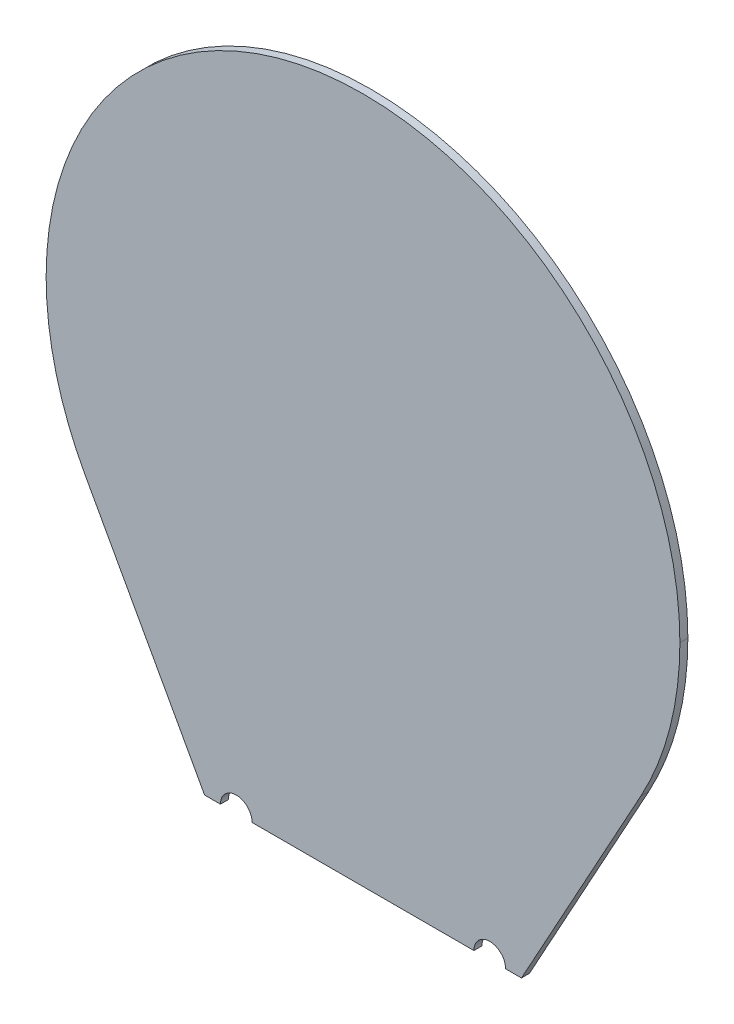
ISO-10303-21;
HEADER;
FILE_DESCRIPTION(('STEP AP214'),'2;1');
FILE_NAME('part.step','',(''),(''),'','','');
FILE_SCHEMA(('AUTOMOTIVE_DESIGN { 1 0 10303 214 1 1 1 1 }'));
ENDSEC;
DATA;
#1=APPLICATION_CONTEXT('core data for automotive mechanical design processes');
#2=APPLICATION_PROTOCOL_DEFINITION('international standard','automotive_design',2000,#1);
#3=PRODUCT_CONTEXT('',#1,'mechanical');
#4=PRODUCT('Part','Part','',(#3));
#5=PRODUCT_RELATED_PRODUCT_CATEGORY('part','',(#4));
#6=PRODUCT_DEFINITION_FORMATION('','',#4);
#7=PRODUCT_DEFINITION_CONTEXT('part definition',#1,'design');
#8=PRODUCT_DEFINITION('design','',#6,#7);
#9=PRODUCT_DEFINITION_SHAPE('','',#8);
#10=(LENGTH_UNIT() NAMED_UNIT(*) SI_UNIT(.MILLI.,.METRE.));
#11=(NAMED_UNIT(*) PLANE_ANGLE_UNIT() SI_UNIT($,.RADIAN.));
#12=(NAMED_UNIT(*) SI_UNIT($,.STERADIAN.) SOLID_ANGLE_UNIT());
#13=UNCERTAINTY_MEASURE_WITH_UNIT(LENGTH_MEASURE(1.E-05),#10,'distance_accuracy_value','');
#14=(GEOMETRIC_REPRESENTATION_CONTEXT(3) GLOBAL_UNCERTAINTY_ASSIGNED_CONTEXT((#13)) GLOBAL_UNIT_ASSIGNED_CONTEXT((#10,
#11,#12)) REPRESENTATION_CONTEXT('',''));
#15=CARTESIAN_POINT('',(0.,0.,0.));
#16=DIRECTION('',(0.,0.,1.));
#17=DIRECTION('',(1.,0.,0.));
#18=AXIS2_PLACEMENT_3D('',#15,#16,#17);
#19=CARTESIAN_POINT('',(12.,-35.,-9.24562));
#20=DIRECTION('',(0.,0.,1.));
#21=DIRECTION('',(1.,0.,0.));
#22=AXIS2_PLACEMENT_3D('',#19,#20,#21);
#23=CYLINDRICAL_SURFACE('',#22,1.5);
#24=CARTESIAN_POINT('',(12.,-35.,0.));
#25=DIRECTION('',(0.,0.,-1.));
#26=DIRECTION('',(1.,0.,0.));
#27=AXIS2_PLACEMENT_3D('',#24,#25,#26);
#28=CIRCLE('',#27,1.5);
#29=CARTESIAN_POINT('',(10.5,-35.,0.));
#30=VERTEX_POINT('',#29);
#31=CARTESIAN_POINT('',(13.5,-35.,0.));
#32=VERTEX_POINT('',#31);
#33=EDGE_CURVE('E126',#30,#32,#28,.T.);
#34=ORIENTED_EDGE('',*,*,#33,.T.);
#35=DIRECTION('',(0.,0.,1.));
#36=VECTOR('',#35,1.);
#37=CARTESIAN_POINT('',(13.5,-35.,-9.24562));
#38=LINE('',#37,#36);
#39=CARTESIAN_POINT('',(13.5,-35.,0.75438));
#40=VERTEX_POINT('',#39);
#41=EDGE_CURVE('E195',#32,#40,#38,.T.);
#42=ORIENTED_EDGE('',*,*,#41,.T.);
#43=CARTESIAN_POINT('',(12.,-35.,0.75438));
#44=DIRECTION('',(0.,0.,-1.));
#45=DIRECTION('',(1.,0.,0.));
#46=AXIS2_PLACEMENT_3D('',#43,#44,#45);
#47=CIRCLE('',#46,1.5);
#48=CARTESIAN_POINT('',(10.5,-35.,0.75438));
#49=VERTEX_POINT('',#48);
#50=EDGE_CURVE('E102',#49,#40,#47,.T.);
#51=ORIENTED_EDGE('',*,*,#50,.F.);
#52=DIRECTION('',(0.,0.,1.));
#53=VECTOR('',#52,1.);
#54=CARTESIAN_POINT('',(10.5,-35.,-9.24562));
#55=LINE('',#54,#53);
#56=EDGE_CURVE('E193',#30,#49,#55,.T.);
#57=ORIENTED_EDGE('',*,*,#56,.F.);
#58=EDGE_LOOP('',(#34,#42,#51,#57));
#59=FACE_BOUND('',#58,.T.);
#60=ADVANCED_FACE('F15',(#59),#23,.F.);
#61=CARTESIAN_POINT('',(-12.,-35.,-9.24562));
#62=DIRECTION('',(0.,0.,1.));
#63=DIRECTION('',(1.,0.,0.));
#64=AXIS2_PLACEMENT_3D('',#61,#62,#63);
#65=CYLINDRICAL_SURFACE('',#64,1.5);
#66=DIRECTION('',(0.,0.,1.));
#67=VECTOR('',#66,1.);
#68=CARTESIAN_POINT('',(-10.5,-35.,-9.24562));
#69=LINE('',#68,#67);
#70=CARTESIAN_POINT('',(-10.5,-35.,0.));
#71=VERTEX_POINT('',#70);
#72=CARTESIAN_POINT('',(-10.5,-35.,0.75438));
#73=VERTEX_POINT('',#72);
#74=EDGE_CURVE('E204',#71,#73,#69,.T.);
#75=ORIENTED_EDGE('',*,*,#74,.T.);
#76=CARTESIAN_POINT('',(-12.,-35.,0.75438));
#77=DIRECTION('',(0.,0.,1.));
#78=DIRECTION('',(1.,0.,0.));
#79=AXIS2_PLACEMENT_3D('',#76,#77,#78);
#80=CIRCLE('',#79,1.5);
#81=CARTESIAN_POINT('',(-13.5,-35.,0.75438));
#82=VERTEX_POINT('',#81);
#83=EDGE_CURVE('E89',#73,#82,#80,.T.);
#84=ORIENTED_EDGE('',*,*,#83,.T.);
#85=DIRECTION('',(0.,0.,1.));
#86=VECTOR('',#85,1.);
#87=CARTESIAN_POINT('',(-13.5,-35.,-9.24562));
#88=LINE('',#87,#86);
#89=CARTESIAN_POINT('',(-13.5,-35.,0.));
#90=VERTEX_POINT('',#89);
#91=EDGE_CURVE('E106',#90,#82,#88,.T.);
#92=ORIENTED_EDGE('',*,*,#91,.F.);
#93=CARTESIAN_POINT('',(-12.,-35.,0.));
#94=DIRECTION('',(0.,0.,1.));
#95=DIRECTION('',(1.,0.,0.));
#96=AXIS2_PLACEMENT_3D('',#93,#94,#95);
#97=CIRCLE('',#96,1.5);
#98=EDGE_CURVE('E130',#71,#90,#97,.T.);
#99=ORIENTED_EDGE('',*,*,#98,.F.);
#100=EDGE_LOOP('',(#75,#84,#92,#99));
#101=FACE_BOUND('',#100,.T.);
#102=ADVANCED_FACE('F245',(#101),#65,.F.);
#103=CARTESIAN_POINT('',(-26.29288464763,-14.44590657958,0.75438));
#104=DIRECTION('',(-0.876429488254857,-0.481530219318922,0.));
#105=DIRECTION('',(-0.481530219318922,0.876429488254857,0.));
#106=AXIS2_PLACEMENT_3D('',#103,#104,#105);
#107=PLANE('',#106);
#108=DIRECTION('',(-0.481530219318922,0.876429488254857,0.));
#109=VECTOR('',#108,1.);
#110=CARTESIAN_POINT('',(-26.29288464763,-14.44590657958,0.));
#111=LINE('',#110,#109);
#112=CARTESIAN_POINT('',(-15.,-35.,0.));
#113=VERTEX_POINT('',#112);
#114=CARTESIAN_POINT('',(-26.29288464763,-14.44590657958,0.));
#115=VERTEX_POINT('',#114);
#116=EDGE_CURVE('E97',#113,#115,#111,.T.);
#117=ORIENTED_EDGE('',*,*,#116,.F.);
#118=DIRECTION('',(0.,0.,-1.));
#119=VECTOR('',#118,1.);
#120=CARTESIAN_POINT('',(-15.,-35.,0.75438));
#121=LINE('',#120,#119);
#122=CARTESIAN_POINT('',(-15.,-35.,0.75438));
#123=VERTEX_POINT('',#122);
#124=EDGE_CURVE('E94',#123,#113,#121,.T.);
#125=ORIENTED_EDGE('',*,*,#124,.F.);
#126=DIRECTION('',(-0.481530219318922,0.876429488254857,0.));
#127=VECTOR('',#126,1.);
#128=CARTESIAN_POINT('',(-26.29288464763,-14.44590657958,0.75438));
#129=LINE('',#128,#127);
#130=CARTESIAN_POINT('',(-26.29288464763,-14.44590657958,0.75438));
#131=VERTEX_POINT('',#130);
#132=EDGE_CURVE('E74',#123,#131,#129,.T.);
#133=ORIENTED_EDGE('',*,*,#132,.T.);
#134=DIRECTION('',(0.,0.,-1.));
#135=VECTOR('',#134,1.);
#136=CARTESIAN_POINT('',(-26.29288464763,-14.44590657958,0.75438));
#137=LINE('',#136,#135);
#138=EDGE_CURVE('E211',#131,#115,#137,.T.);
#139=ORIENTED_EDGE('',*,*,#138,.T.);
#140=EDGE_LOOP('',(#117,#125,#133,#139));
#141=FACE_BOUND('',#140,.T.);
#142=ADVANCED_FACE('F95',(#141),#107,.T.);
#143=CARTESIAN_POINT('',(0.,0.,0.75438));
#144=DIRECTION('',(0.,0.,-1.));
#145=DIRECTION('',(-1.,0.,0.));
#146=AXIS2_PLACEMENT_3D('',#143,#144,#145);
#147=CYLINDRICAL_SURFACE('',#146,30.);
#148=DIRECTION('',(0.,0.,-1.));
#149=VECTOR('',#148,1.);
#150=CARTESIAN_POINT('',(30.,0.,0.75438));
#151=LINE('',#150,#149);
#152=CARTESIAN_POINT('',(30.,0.,0.75438));
#153=VERTEX_POINT('',#152);
#154=CARTESIAN_POINT('',(30.,0.,0.));
#155=VERTEX_POINT('',#154);
#156=EDGE_CURVE('E159',#153,#155,#151,.T.);
#157=ORIENTED_EDGE('',*,*,#156,.F.);
#158=CARTESIAN_POINT('',(0.,0.,0.75438));
#159=DIRECTION('',(0.,0.,1.));
#160=DIRECTION('',(1.,0.,0.));
#161=AXIS2_PLACEMENT_3D('',#158,#159,#160);
#162=CIRCLE('',#161,30.);
#163=CARTESIAN_POINT('',(26.292884647637,-14.44590657958,0.75438));
#164=VERTEX_POINT('',#163);
#165=EDGE_CURVE('E90',#164,#153,#162,.T.);
#166=ORIENTED_EDGE('',*,*,#165,.F.);
#167=DIRECTION('',(0.,0.,-1.));
#168=VECTOR('',#167,1.);
#169=CARTESIAN_POINT('',(26.292884647637,-14.44590657958,0.75438));
#170=LINE('',#169,#168);
#171=CARTESIAN_POINT('',(26.292884647637,-14.44590657958,0.));
#172=VERTEX_POINT('',#171);
#173=EDGE_CURVE('E10',#164,#172,#170,.T.);
#174=ORIENTED_EDGE('',*,*,#173,.T.);
#175=CARTESIAN_POINT('',(0.,0.,0.));
#176=DIRECTION('',(0.,0.,1.));
#177=DIRECTION('',(1.,0.,0.));
#178=AXIS2_PLACEMENT_3D('',#175,#176,#177);
#179=CIRCLE('',#178,30.);
#180=EDGE_CURVE('E135',#172,#155,#179,.T.);
#181=ORIENTED_EDGE('',*,*,#180,.T.);
#182=EDGE_LOOP('',(#157,#166,#174,#181));
#183=FACE_BOUND('',#182,.T.);
#184=ADVANCED_FACE('F157',(#183),#147,.T.);
#185=CARTESIAN_POINT('',(26.292884647637,-14.44590657958,0.75438));
#186=DIRECTION('',(-0.876429488254857,0.481530219318922,0.));
#187=DIRECTION('',(0.,0.,1.));
#188=AXIS2_PLACEMENT_3D('',#185,#186,#187);
#189=PLANE('',#188);
#190=DIRECTION('',(0.481530219318922,0.876429488254857,0.));
#191=VECTOR('',#190,1.);
#192=CARTESIAN_POINT('',(26.292884647637,-14.44590657958,0.));
#193=LINE('',#192,#191);
#194=CARTESIAN_POINT('',(15.,-35.,0.));
#195=VERTEX_POINT('',#194);
#196=EDGE_CURVE('E24',#195,#172,#193,.T.);
#197=ORIENTED_EDGE('',*,*,#196,.T.);
#198=ORIENTED_EDGE('',*,*,#173,.F.);
#199=DIRECTION('',(0.481530219318922,0.876429488254857,0.));
#200=VECTOR('',#199,1.);
#201=CARTESIAN_POINT('',(26.292884647637,-14.44590657958,0.75438));
#202=LINE('',#201,#200);
#203=CARTESIAN_POINT('',(15.,-35.,0.75438));
#204=VERTEX_POINT('',#203);
#205=EDGE_CURVE('E117',#204,#164,#202,.T.);
#206=ORIENTED_EDGE('',*,*,#205,.F.);
#207=DIRECTION('',(0.,0.,-1.));
#208=VECTOR('',#207,1.);
#209=CARTESIAN_POINT('',(15.,-35.,0.75438));
#210=LINE('',#209,#208);
#211=EDGE_CURVE('E144',#204,#195,#210,.T.);
#212=ORIENTED_EDGE('',*,*,#211,.T.);
#213=EDGE_LOOP('',(#197,#198,#206,#212));
#214=FACE_BOUND('',#213,.T.);
#215=ADVANCED_FACE('F142',(#214),#189,.F.);
#216=CARTESIAN_POINT('',(0.,0.,0.));
#217=DIRECTION('',(0.,0.,1.));
#218=DIRECTION('',(1.,0.,0.));
#219=AXIS2_PLACEMENT_3D('',#216,#217,#218);
#220=PLANE('',#219);
#221=ORIENTED_EDGE('',*,*,#33,.F.);
#222=DIRECTION('',(1.,0.,0.));
#223=VECTOR('',#222,1.);
#224=CARTESIAN_POINT('',(0.,-35.,0.));
#225=LINE('',#224,#223);
#226=EDGE_CURVE('E209',#71,#30,#225,.T.);
#227=ORIENTED_EDGE('',*,*,#226,.F.);
#228=ORIENTED_EDGE('',*,*,#98,.T.);
#229=DIRECTION('',(1.,0.,0.));
#230=VECTOR('',#229,1.);
#231=CARTESIAN_POINT('',(0.,-35.,0.));
#232=LINE('',#231,#230);
#233=EDGE_CURVE('E112',#113,#90,#232,.T.);
#234=ORIENTED_EDGE('',*,*,#233,.F.);
#235=ORIENTED_EDGE('',*,*,#116,.T.);
#236=CARTESIAN_POINT('',(0.,0.,0.));
#237=DIRECTION('',(0.,0.,1.));
#238=DIRECTION('',(1.,0.,0.));
#239=AXIS2_PLACEMENT_3D('',#236,#237,#238);
#240=CIRCLE('',#239,30.);
#241=CARTESIAN_POINT('',(-30.,0.,0.));
#242=VERTEX_POINT('',#241);
#243=EDGE_CURVE('E216',#242,#115,#240,.T.);
#244=ORIENTED_EDGE('',*,*,#243,.F.);
#245=CARTESIAN_POINT('',(0.,0.,0.));
#246=DIRECTION('',(0.,0.,1.));
#247=DIRECTION('',(1.,0.,0.));
#248=AXIS2_PLACEMENT_3D('',#245,#246,#247);
#249=CIRCLE('',#248,30.);
#250=EDGE_CURVE('E154',#155,#242,#249,.T.);
#251=ORIENTED_EDGE('',*,*,#250,.F.);
#252=ORIENTED_EDGE('',*,*,#180,.F.);
#253=ORIENTED_EDGE('',*,*,#196,.F.);
#254=DIRECTION('',(1.,0.,0.));
#255=VECTOR('',#254,1.);
#256=CARTESIAN_POINT('',(0.,-35.,0.));
#257=LINE('',#256,#255);
#258=EDGE_CURVE('E222',#32,#195,#257,.T.);
#259=ORIENTED_EDGE('',*,*,#258,.F.);
#260=EDGE_LOOP('',(#221,#227,#228,#234,#235,#244,#251,#252,#253,#259));
#261=FACE_BOUND('',#260,.T.);
#262=ADVANCED_FACE('F150',(#261),#220,.F.);
#263=CARTESIAN_POINT('',(0.,0.,0.75438));
#264=DIRECTION('',(0.,0.,1.));
#265=DIRECTION('',(1.,0.,0.));
#266=AXIS2_PLACEMENT_3D('',#263,#264,#265);
#267=PLANE('',#266);
#268=DIRECTION('',(1.,0.,0.));
#269=VECTOR('',#268,1.);
#270=CARTESIAN_POINT('',(0.,-35.,0.75438));
#271=LINE('',#270,#269);
#272=EDGE_CURVE('E199',#73,#49,#271,.T.);
#273=ORIENTED_EDGE('',*,*,#272,.T.);
#274=ORIENTED_EDGE('',*,*,#50,.T.);
#275=DIRECTION('',(1.,0.,0.));
#276=VECTOR('',#275,1.);
#277=CARTESIAN_POINT('',(0.,-35.,0.75438));
#278=LINE('',#277,#276);
#279=EDGE_CURVE('E227',#40,#204,#278,.T.);
#280=ORIENTED_EDGE('',*,*,#279,.T.);
#281=ORIENTED_EDGE('',*,*,#205,.T.);
#282=ORIENTED_EDGE('',*,*,#165,.T.);
#283=CARTESIAN_POINT('',(0.,0.,0.75438));
#284=DIRECTION('',(0.,0.,1.));
#285=DIRECTION('',(1.,0.,0.));
#286=AXIS2_PLACEMENT_3D('',#283,#284,#285);
#287=CIRCLE('',#286,30.);
#288=CARTESIAN_POINT('',(-30.,0.,0.75438));
#289=VERTEX_POINT('',#288);
#290=EDGE_CURVE('E384',#153,#289,#287,.T.);
#291=ORIENTED_EDGE('',*,*,#290,.T.);
#292=CARTESIAN_POINT('',(0.,0.,0.75438));
#293=DIRECTION('',(0.,0.,1.));
#294=DIRECTION('',(1.,0.,0.));
#295=AXIS2_PLACEMENT_3D('',#292,#293,#294);
#296=CIRCLE('',#295,30.);
#297=EDGE_CURVE('E84',#289,#131,#296,.T.);
#298=ORIENTED_EDGE('',*,*,#297,.T.);
#299=ORIENTED_EDGE('',*,*,#132,.F.);
#300=DIRECTION('',(1.,0.,0.));
#301=VECTOR('',#300,1.);
#302=CARTESIAN_POINT('',(0.,-35.,0.75438));
#303=LINE('',#302,#301);
#304=EDGE_CURVE('E79',#123,#82,#303,.T.);
#305=ORIENTED_EDGE('',*,*,#304,.T.);
#306=ORIENTED_EDGE('',*,*,#83,.F.);
#307=EDGE_LOOP('',(#273,#274,#280,#281,#282,#291,#298,#299,#305,#306));
#308=FACE_BOUND('',#307,.T.);
#309=ADVANCED_FACE('F77',(#308),#267,.T.);
#310=CARTESIAN_POINT('',(0.,-35.,0.75438));
#311=DIRECTION('',(0.,1.,0.));
#312=DIRECTION('',(1.,0.,0.));
#313=AXIS2_PLACEMENT_3D('',#310,#311,#312);
#314=PLANE('',#313);
#315=ORIENTED_EDGE('',*,*,#233,.T.);
#316=ORIENTED_EDGE('',*,*,#91,.T.);
#317=ORIENTED_EDGE('',*,*,#304,.F.);
#318=ORIENTED_EDGE('',*,*,#124,.T.);
#319=EDGE_LOOP('',(#315,#316,#317,#318));
#320=FACE_BOUND('',#319,.T.);
#321=ADVANCED_FACE('F104',(#320),#314,.F.);
#322=CARTESIAN_POINT('',(0.,-35.,0.75438));
#323=DIRECTION('',(0.,1.,0.));
#324=DIRECTION('',(1.,0.,0.));
#325=AXIS2_PLACEMENT_3D('',#322,#323,#324);
#326=PLANE('',#325);
#327=ORIENTED_EDGE('',*,*,#41,.F.);
#328=ORIENTED_EDGE('',*,*,#258,.T.);
#329=ORIENTED_EDGE('',*,*,#211,.F.);
#330=ORIENTED_EDGE('',*,*,#279,.F.);
#331=EDGE_LOOP('',(#327,#328,#329,#330));
#332=FACE_BOUND('',#331,.T.);
#333=ADVANCED_FACE('F308',(#332),#326,.F.);
#334=CARTESIAN_POINT('',(0.,-35.,0.75438));
#335=DIRECTION('',(0.,1.,0.));
#336=DIRECTION('',(1.,0.,0.));
#337=AXIS2_PLACEMENT_3D('',#334,#335,#336);
#338=PLANE('',#337);
#339=ORIENTED_EDGE('',*,*,#56,.T.);
#340=ORIENTED_EDGE('',*,*,#272,.F.);
#341=ORIENTED_EDGE('',*,*,#74,.F.);
#342=ORIENTED_EDGE('',*,*,#226,.T.);
#343=EDGE_LOOP('',(#339,#340,#341,#342));
#344=FACE_BOUND('',#343,.T.);
#345=ADVANCED_FACE('F207',(#344),#338,.F.);
#346=CARTESIAN_POINT('',(0.,0.,0.75438));
#347=DIRECTION('',(0.,0.,-1.));
#348=DIRECTION('',(-1.,0.,0.));
#349=AXIS2_PLACEMENT_3D('',#346,#347,#348);
#350=CYLINDRICAL_SURFACE('',#349,30.);
#351=ORIENTED_EDGE('',*,*,#297,.F.);
#352=DIRECTION('',(0.,0.,-1.));
#353=VECTOR('',#352,1.);
#354=CARTESIAN_POINT('',(-30.,0.,0.75438));
#355=LINE('',#354,#353);
#356=EDGE_CURVE('E237',#289,#242,#355,.T.);
#357=ORIENTED_EDGE('',*,*,#356,.T.);
#358=ORIENTED_EDGE('',*,*,#243,.T.);
#359=ORIENTED_EDGE('',*,*,#138,.F.);
#360=EDGE_LOOP('',(#351,#357,#358,#359));
#361=FACE_BOUND('',#360,.T.);
#362=ADVANCED_FACE('F321',(#361),#350,.T.);
#363=CARTESIAN_POINT('',(0.,0.,0.75438));
#364=DIRECTION('',(0.,0.,-1.));
#365=DIRECTION('',(-1.,0.,0.));
#366=AXIS2_PLACEMENT_3D('',#363,#364,#365);
#367=CYLINDRICAL_SURFACE('',#366,30.);
#368=ORIENTED_EDGE('',*,*,#290,.F.);
#369=ORIENTED_EDGE('',*,*,#156,.T.);
#370=ORIENTED_EDGE('',*,*,#250,.T.);
#371=ORIENTED_EDGE('',*,*,#356,.F.);
#372=EDGE_LOOP('',(#368,#369,#370,#371));
#373=FACE_BOUND('',#372,.T.);
#374=ADVANCED_FACE('F337',(#373),#367,.T.);
#375=CLOSED_SHELL('',(#60,#102,#142,#184,#215,#262,#309,#321,#333,#345,#362,#374));
#376=MANIFOLD_SOLID_BREP('B1',#375);
#377=ADVANCED_BREP_SHAPE_REPRESENTATION('',(#18,#376),#14);
#378=SHAPE_DEFINITION_REPRESENTATION(#9,#377);
ENDSEC;
END-ISO-10303-21;
